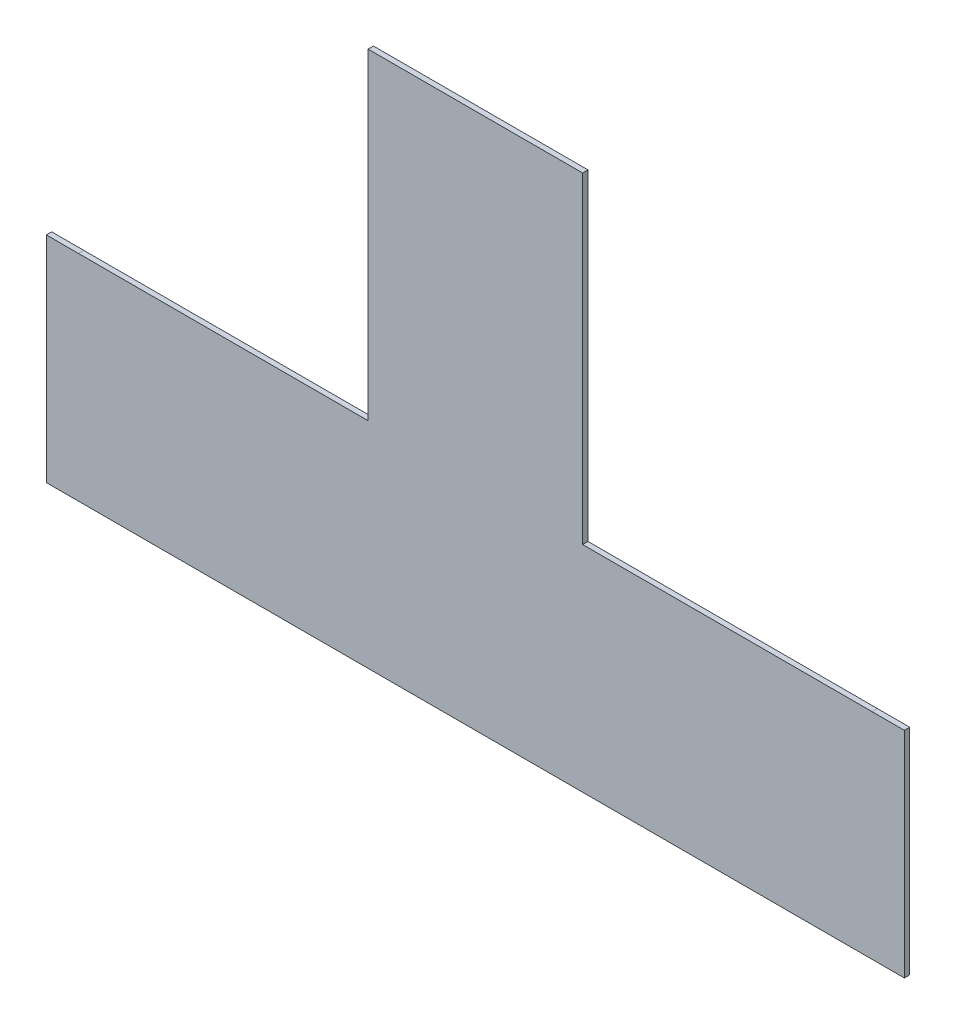
ISO-10303-21;
HEADER;
FILE_DESCRIPTION(('STEP AP214'),'2;1');
FILE_NAME('part.step','',(''),(''),'','','');
FILE_SCHEMA(('AUTOMOTIVE_DESIGN { 1 0 10303 214 1 1 1 1 }'));
ENDSEC;
DATA;
#1=APPLICATION_CONTEXT('core data for automotive mechanical design processes');
#2=APPLICATION_PROTOCOL_DEFINITION('international standard','automotive_design',2000,#1);
#3=PRODUCT_CONTEXT('',#1,'mechanical');
#4=PRODUCT('Part','Part','',(#3));
#5=PRODUCT_RELATED_PRODUCT_CATEGORY('part','',(#4));
#6=PRODUCT_DEFINITION_FORMATION('','',#4);
#7=PRODUCT_DEFINITION_CONTEXT('part definition',#1,'design');
#8=PRODUCT_DEFINITION('design','',#6,#7);
#9=PRODUCT_DEFINITION_SHAPE('','',#8);
#10=(LENGTH_UNIT() NAMED_UNIT(*) SI_UNIT(.MILLI.,.METRE.));
#11=(NAMED_UNIT(*) PLANE_ANGLE_UNIT() SI_UNIT($,.RADIAN.));
#12=(NAMED_UNIT(*) SI_UNIT($,.STERADIAN.) SOLID_ANGLE_UNIT());
#13=UNCERTAINTY_MEASURE_WITH_UNIT(LENGTH_MEASURE(1.E-05),#10,'distance_accuracy_value','');
#14=(GEOMETRIC_REPRESENTATION_CONTEXT(3) GLOBAL_UNCERTAINTY_ASSIGNED_CONTEXT((#13)) GLOBAL_UNIT_ASSIGNED_CONTEXT((#10,
#11,#12)) REPRESENTATION_CONTEXT('',''));
#15=CARTESIAN_POINT('',(0.,0.,0.));
#16=DIRECTION('',(0.,0.,1.));
#17=DIRECTION('',(1.,0.,0.));
#18=AXIS2_PLACEMENT_3D('',#15,#16,#17);
#19=CARTESIAN_POINT('',(0.,40.,1.));
#20=DIRECTION('',(0.,1.,0.));
#21=DIRECTION('',(-1.,0.,0.));
#22=AXIS2_PLACEMENT_3D('',#19,#20,#21);
#23=PLANE('',#22);
#24=DIRECTION('',(1.,0.,0.));
#25=VECTOR('',#24,1.);
#26=CARTESIAN_POINT('',(0.,40.,0.));
#27=LINE('',#26,#25);
#28=CARTESIAN_POINT('',(6.00000000000011,40.,0.));
#29=VERTEX_POINT('',#28);
#30=CARTESIAN_POINT('',(59.9999999999999,40.,0.));
#31=VERTEX_POINT('',#30);
#32=EDGE_CURVE('E180',#29,#31,#27,.T.);
#33=ORIENTED_EDGE('',*,*,#32,.F.);
#34=DIRECTION('',(0.,0.,1.));
#35=VECTOR('',#34,1.);
#36=CARTESIAN_POINT('',(6.0000000000001,40.,0.99999999999999));
#37=LINE('',#36,#35);
#38=CARTESIAN_POINT('',(6.0000000000001,40.,1.));
#39=VERTEX_POINT('',#38);
#40=EDGE_CURVE('E11',#29,#39,#37,.T.);
#41=ORIENTED_EDGE('',*,*,#40,.T.);
#42=DIRECTION('',(1.,0.,0.));
#43=VECTOR('',#42,1.);
#44=CARTESIAN_POINT('',(0.,40.,1.));
#45=LINE('',#44,#43);
#46=CARTESIAN_POINT('',(59.9999999999999,40.,1.));
#47=VERTEX_POINT('',#46);
#48=EDGE_CURVE('E150',#39,#47,#45,.T.);
#49=ORIENTED_EDGE('',*,*,#48,.T.);
#50=DIRECTION('',(0.,0.,-1.));
#51=VECTOR('',#50,1.);
#52=CARTESIAN_POINT('',(59.9999999999999,40.,1.));
#53=LINE('',#52,#51);
#54=EDGE_CURVE('E134',#47,#31,#53,.T.);
#55=ORIENTED_EDGE('',*,*,#54,.T.);
#56=EDGE_LOOP('',(#33,#41,#49,#55));
#57=FACE_BOUND('',#56,.T.);
#58=ADVANCED_FACE('F49',(#57),#23,.T.);
#59=CARTESIAN_POINT('',(0.,40.,1.));
#60=DIRECTION('',(0.,-1.,0.));
#61=DIRECTION('',(1.,0.,0.));
#62=AXIS2_PLACEMENT_3D('',#59,#60,#61);
#63=PLANE('',#62);
#64=DIRECTION('',(0.,0.,1.));
#65=VECTOR('',#64,1.);
#66=CARTESIAN_POINT('',(154.,40.,1.));
#67=LINE('',#66,#65);
#68=CARTESIAN_POINT('',(154.,40.,0.));
#69=VERTEX_POINT('',#68);
#70=CARTESIAN_POINT('',(154.,40.,1.));
#71=VERTEX_POINT('',#70);
#72=EDGE_CURVE('E58',#69,#71,#67,.T.);
#73=ORIENTED_EDGE('',*,*,#72,.F.);
#74=DIRECTION('',(-1.,0.,0.));
#75=VECTOR('',#74,1.);
#76=CARTESIAN_POINT('',(0.,40.,0.));
#77=LINE('',#76,#75);
#78=CARTESIAN_POINT('',(100.,40.,0.));
#79=VERTEX_POINT('',#78);
#80=EDGE_CURVE('E195',#69,#79,#77,.T.);
#81=ORIENTED_EDGE('',*,*,#80,.T.);
#82=DIRECTION('',(0.,0.,-1.));
#83=VECTOR('',#82,1.);
#84=CARTESIAN_POINT('',(100.,40.,1.));
#85=LINE('',#84,#83);
#86=CARTESIAN_POINT('',(100.,40.,1.));
#87=VERTEX_POINT('',#86);
#88=EDGE_CURVE('E205',#87,#79,#85,.T.);
#89=ORIENTED_EDGE('',*,*,#88,.F.);
#90=DIRECTION('',(-1.,0.,0.));
#91=VECTOR('',#90,1.);
#92=CARTESIAN_POINT('',(0.,40.,1.));
#93=LINE('',#92,#91);
#94=EDGE_CURVE('E167',#71,#87,#93,.T.);
#95=ORIENTED_EDGE('',*,*,#94,.F.);
#96=EDGE_LOOP('',(#73,#81,#89,#95));
#97=FACE_BOUND('',#96,.T.);
#98=ADVANCED_FACE('F234',(#97),#63,.F.);
#99=CARTESIAN_POINT('',(0.,100.,1.));
#100=DIRECTION('',(0.,1.,0.));
#101=DIRECTION('',(0.,0.,1.));
#102=AXIS2_PLACEMENT_3D('',#99,#100,#101);
#103=PLANE('',#102);
#104=DIRECTION('',(1.,0.,0.));
#105=VECTOR('',#104,1.);
#106=CARTESIAN_POINT('',(0.,100.,0.));
#107=LINE('',#106,#105);
#108=CARTESIAN_POINT('',(59.9999999999999,100.,0.));
#109=VERTEX_POINT('',#108);
#110=CARTESIAN_POINT('',(100.,100.,0.));
#111=VERTEX_POINT('',#110);
#112=EDGE_CURVE('E128',#109,#111,#107,.T.);
#113=ORIENTED_EDGE('',*,*,#112,.F.);
#114=DIRECTION('',(0.,0.,-1.));
#115=VECTOR('',#114,1.);
#116=CARTESIAN_POINT('',(59.9999999999999,100.,1.));
#117=LINE('',#116,#115);
#118=CARTESIAN_POINT('',(59.9999999999999,100.,1.));
#119=VERTEX_POINT('',#118);
#120=EDGE_CURVE('E124',#119,#109,#117,.T.);
#121=ORIENTED_EDGE('',*,*,#120,.F.);
#122=DIRECTION('',(1.,0.,0.));
#123=VECTOR('',#122,1.);
#124=CARTESIAN_POINT('',(0.,100.,1.));
#125=LINE('',#124,#123);
#126=CARTESIAN_POINT('',(100.,100.,1.));
#127=VERTEX_POINT('',#126);
#128=EDGE_CURVE('E126',#119,#127,#125,.T.);
#129=ORIENTED_EDGE('',*,*,#128,.T.);
#130=DIRECTION('',(0.,0.,-1.));
#131=VECTOR('',#130,1.);
#132=CARTESIAN_POINT('',(100.,100.,1.));
#133=LINE('',#132,#131);
#134=EDGE_CURVE('E174',#127,#111,#133,.T.);
#135=ORIENTED_EDGE('',*,*,#134,.T.);
#136=EDGE_LOOP('',(#113,#121,#129,#135));
#137=FACE_BOUND('',#136,.T.);
#138=ADVANCED_FACE('F51',(#137),#103,.T.);
#139=CARTESIAN_POINT('',(59.9999999999999,0.,1.));
#140=DIRECTION('',(-1.,0.,0.));
#141=DIRECTION('',(0.,0.,1.));
#142=AXIS2_PLACEMENT_3D('',#139,#140,#141);
#143=PLANE('',#142);
#144=DIRECTION('',(0.,1.,0.));
#145=VECTOR('',#144,1.);
#146=CARTESIAN_POINT('',(59.9999999999999,0.,0.));
#147=LINE('',#146,#145);
#148=EDGE_CURVE('E177',#31,#109,#147,.T.);
#149=ORIENTED_EDGE('',*,*,#148,.F.);
#150=ORIENTED_EDGE('',*,*,#54,.F.);
#151=DIRECTION('',(0.,1.,0.));
#152=VECTOR('',#151,1.);
#153=CARTESIAN_POINT('',(59.9999999999999,0.,1.));
#154=LINE('',#153,#152);
#155=EDGE_CURVE('E139',#47,#119,#154,.T.);
#156=ORIENTED_EDGE('',*,*,#155,.T.);
#157=ORIENTED_EDGE('',*,*,#120,.T.);
#158=EDGE_LOOP('',(#149,#150,#156,#157));
#159=FACE_BOUND('',#158,.T.);
#160=ADVANCED_FACE('F147',(#159),#143,.T.);
#161=ORIENTED_EDGE('',*,*,#40,.F.);
#162=CARTESIAN_POINT('',(0.,40.,0.));
#163=VERTEX_POINT('',#162);
#164=EDGE_CURVE('E181',#163,#29,#27,.T.);
#165=ORIENTED_EDGE('',*,*,#164,.F.);
#166=DIRECTION('',(0.,0.,-1.));
#167=VECTOR('',#166,1.);
#168=CARTESIAN_POINT('',(0.,40.,1.));
#169=LINE('',#168,#167);
#170=CARTESIAN_POINT('',(0.,40.,1.));
#171=VERTEX_POINT('',#170);
#172=EDGE_CURVE('E220',#171,#163,#169,.T.);
#173=ORIENTED_EDGE('',*,*,#172,.F.);
#174=EDGE_CURVE('E153',#171,#39,#45,.T.);
#175=ORIENTED_EDGE('',*,*,#174,.T.);
#176=EDGE_LOOP('',(#161,#165,#173,#175));
#177=FACE_BOUND('',#176,.T.);
#178=ADVANCED_FACE('F251',(#177),#23,.T.);
#179=CARTESIAN_POINT('',(0.,0.,1.));
#180=DIRECTION('',(-1.,0.,0.));
#181=DIRECTION('',(0.,0.,1.));
#182=AXIS2_PLACEMENT_3D('',#179,#180,#181);
#183=PLANE('',#182);
#184=DIRECTION('',(0.,1.,0.));
#185=VECTOR('',#184,1.);
#186=CARTESIAN_POINT('',(0.,0.,0.));
#187=LINE('',#186,#185);
#188=CARTESIAN_POINT('',(0.,0.,0.));
#189=VERTEX_POINT('',#188);
#190=EDGE_CURVE('E185',#189,#163,#187,.T.);
#191=ORIENTED_EDGE('',*,*,#190,.F.);
#192=DIRECTION('',(0.,0.,-1.));
#193=VECTOR('',#192,1.);
#194=CARTESIAN_POINT('',(0.,0.,1.));
#195=LINE('',#194,#193);
#196=CARTESIAN_POINT('',(0.,0.,1.));
#197=VERTEX_POINT('',#196);
#198=EDGE_CURVE('E217',#197,#189,#195,.T.);
#199=ORIENTED_EDGE('',*,*,#198,.F.);
#200=DIRECTION('',(0.,1.,0.));
#201=VECTOR('',#200,1.);
#202=CARTESIAN_POINT('',(0.,0.,1.));
#203=LINE('',#202,#201);
#204=EDGE_CURVE('E157',#197,#171,#203,.T.);
#205=ORIENTED_EDGE('',*,*,#204,.T.);
#206=ORIENTED_EDGE('',*,*,#172,.T.);
#207=EDGE_LOOP('',(#191,#199,#205,#206));
#208=FACE_BOUND('',#207,.T.);
#209=ADVANCED_FACE('F254',(#208),#183,.T.);
#210=CARTESIAN_POINT('',(0.,0.,1.));
#211=DIRECTION('',(0.,1.,0.));
#212=DIRECTION('',(-1.,0.,0.));
#213=AXIS2_PLACEMENT_3D('',#210,#211,#212);
#214=PLANE('',#213);
#215=DIRECTION('',(1.,0.,0.));
#216=VECTOR('',#215,1.);
#217=CARTESIAN_POINT('',(0.,0.,0.));
#218=LINE('',#217,#216);
#219=CARTESIAN_POINT('',(160.,0.,0.));
#220=VERTEX_POINT('',#219);
#221=EDGE_CURVE('E189',#189,#220,#218,.T.);
#222=ORIENTED_EDGE('',*,*,#221,.T.);
#223=DIRECTION('',(0.,0.,-1.));
#224=VECTOR('',#223,1.);
#225=CARTESIAN_POINT('',(160.,0.,1.));
#226=LINE('',#225,#224);
#227=CARTESIAN_POINT('',(160.,0.,1.));
#228=VERTEX_POINT('',#227);
#229=EDGE_CURVE('E213',#228,#220,#226,.T.);
#230=ORIENTED_EDGE('',*,*,#229,.F.);
#231=DIRECTION('',(1.,0.,0.));
#232=VECTOR('',#231,1.);
#233=CARTESIAN_POINT('',(0.,0.,1.));
#234=LINE('',#233,#232);
#235=EDGE_CURVE('E161',#197,#228,#234,.T.);
#236=ORIENTED_EDGE('',*,*,#235,.F.);
#237=ORIENTED_EDGE('',*,*,#198,.T.);
#238=EDGE_LOOP('',(#222,#230,#236,#237));
#239=FACE_BOUND('',#238,.T.);
#240=ADVANCED_FACE('F256',(#239),#214,.F.);
#241=CARTESIAN_POINT('',(160.,0.,1.));
#242=DIRECTION('',(-1.,0.,0.));
#243=DIRECTION('',(0.,0.,1.));
#244=AXIS2_PLACEMENT_3D('',#241,#242,#243);
#245=PLANE('',#244);
#246=DIRECTION('',(0.,1.,0.));
#247=VECTOR('',#246,1.);
#248=CARTESIAN_POINT('',(160.,0.,0.));
#249=LINE('',#248,#247);
#250=CARTESIAN_POINT('',(160.,40.,0.));
#251=VERTEX_POINT('',#250);
#252=EDGE_CURVE('E192',#220,#251,#249,.T.);
#253=ORIENTED_EDGE('',*,*,#252,.T.);
#254=DIRECTION('',(0.,0.,-1.));
#255=VECTOR('',#254,1.);
#256=CARTESIAN_POINT('',(160.,40.,1.));
#257=LINE('',#256,#255);
#258=CARTESIAN_POINT('',(160.,40.,1.));
#259=VERTEX_POINT('',#258);
#260=EDGE_CURVE('E209',#259,#251,#257,.T.);
#261=ORIENTED_EDGE('',*,*,#260,.F.);
#262=DIRECTION('',(0.,1.,0.));
#263=VECTOR('',#262,1.);
#264=CARTESIAN_POINT('',(160.,0.,1.));
#265=LINE('',#264,#263);
#266=EDGE_CURVE('E164',#228,#259,#265,.T.);
#267=ORIENTED_EDGE('',*,*,#266,.F.);
#268=ORIENTED_EDGE('',*,*,#229,.T.);
#269=EDGE_LOOP('',(#253,#261,#267,#268));
#270=FACE_BOUND('',#269,.T.);
#271=ADVANCED_FACE('F242',(#270),#245,.F.);
#272=EDGE_CURVE('E196',#251,#69,#77,.T.);
#273=ORIENTED_EDGE('',*,*,#272,.T.);
#274=ORIENTED_EDGE('',*,*,#72,.T.);
#275=EDGE_CURVE('E168',#259,#71,#93,.T.);
#276=ORIENTED_EDGE('',*,*,#275,.F.);
#277=ORIENTED_EDGE('',*,*,#260,.T.);
#278=EDGE_LOOP('',(#273,#274,#276,#277));
#279=FACE_BOUND('',#278,.T.);
#280=ADVANCED_FACE('F229',(#279),#63,.F.);
#281=CARTESIAN_POINT('',(100.,0.,1.));
#282=DIRECTION('',(-1.,0.,0.));
#283=DIRECTION('',(0.,0.,1.));
#284=AXIS2_PLACEMENT_3D('',#281,#282,#283);
#285=PLANE('',#284);
#286=DIRECTION('',(0.,1.,0.));
#287=VECTOR('',#286,1.);
#288=CARTESIAN_POINT('',(100.,0.,0.));
#289=LINE('',#288,#287);
#290=EDGE_CURVE('E144',#79,#111,#289,.T.);
#291=ORIENTED_EDGE('',*,*,#290,.T.);
#292=ORIENTED_EDGE('',*,*,#134,.F.);
#293=DIRECTION('',(0.,1.,0.));
#294=VECTOR('',#293,1.);
#295=CARTESIAN_POINT('',(100.,0.,1.));
#296=LINE('',#295,#294);
#297=EDGE_CURVE('E141',#87,#127,#296,.T.);
#298=ORIENTED_EDGE('',*,*,#297,.F.);
#299=ORIENTED_EDGE('',*,*,#88,.T.);
#300=EDGE_LOOP('',(#291,#292,#298,#299));
#301=FACE_BOUND('',#300,.T.);
#302=ADVANCED_FACE('F309',(#301),#285,.F.);
#303=CARTESIAN_POINT('',(0.,0.,1.));
#304=DIRECTION('',(0.,0.,1.));
#305=DIRECTION('',(1.,0.,0.));
#306=AXIS2_PLACEMENT_3D('',#303,#304,#305);
#307=PLANE('',#306);
#308=ORIENTED_EDGE('',*,*,#128,.F.);
#309=ORIENTED_EDGE('',*,*,#155,.F.);
#310=ORIENTED_EDGE('',*,*,#48,.F.);
#311=ORIENTED_EDGE('',*,*,#174,.F.);
#312=ORIENTED_EDGE('',*,*,#204,.F.);
#313=ORIENTED_EDGE('',*,*,#235,.T.);
#314=ORIENTED_EDGE('',*,*,#266,.T.);
#315=ORIENTED_EDGE('',*,*,#275,.T.);
#316=ORIENTED_EDGE('',*,*,#94,.T.);
#317=ORIENTED_EDGE('',*,*,#297,.T.);
#318=EDGE_LOOP('',(#308,#309,#310,#311,#312,#313,#314,#315,#316,#317));
#319=FACE_BOUND('',#318,.T.);
#320=ADVANCED_FACE('F138',(#319),#307,.T.);
#321=CARTESIAN_POINT('',(0.,0.,0.));
#322=DIRECTION('',(0.,0.,1.));
#323=DIRECTION('',(1.,0.,0.));
#324=AXIS2_PLACEMENT_3D('',#321,#322,#323);
#325=PLANE('',#324);
#326=ORIENTED_EDGE('',*,*,#112,.T.);
#327=ORIENTED_EDGE('',*,*,#290,.F.);
#328=ORIENTED_EDGE('',*,*,#80,.F.);
#329=ORIENTED_EDGE('',*,*,#272,.F.);
#330=ORIENTED_EDGE('',*,*,#252,.F.);
#331=ORIENTED_EDGE('',*,*,#221,.F.);
#332=ORIENTED_EDGE('',*,*,#190,.T.);
#333=ORIENTED_EDGE('',*,*,#164,.T.);
#334=ORIENTED_EDGE('',*,*,#32,.T.);
#335=ORIENTED_EDGE('',*,*,#148,.T.);
#336=EDGE_LOOP('',(#326,#327,#328,#329,#330,#331,#332,#333,#334,#335));
#337=FACE_BOUND('',#336,.T.);
#338=ADVANCED_FACE('F245',(#337),#325,.F.);
#339=CLOSED_SHELL('',(#58,#98,#138,#160,#178,#209,#240,#271,#280,#302,#320,#338));
#340=MANIFOLD_SOLID_BREP('B2',#339);
#341=ADVANCED_BREP_SHAPE_REPRESENTATION('',(#18,#340),#14);
#342=SHAPE_DEFINITION_REPRESENTATION(#9,#341);
ENDSEC;
END-ISO-10303-21;
